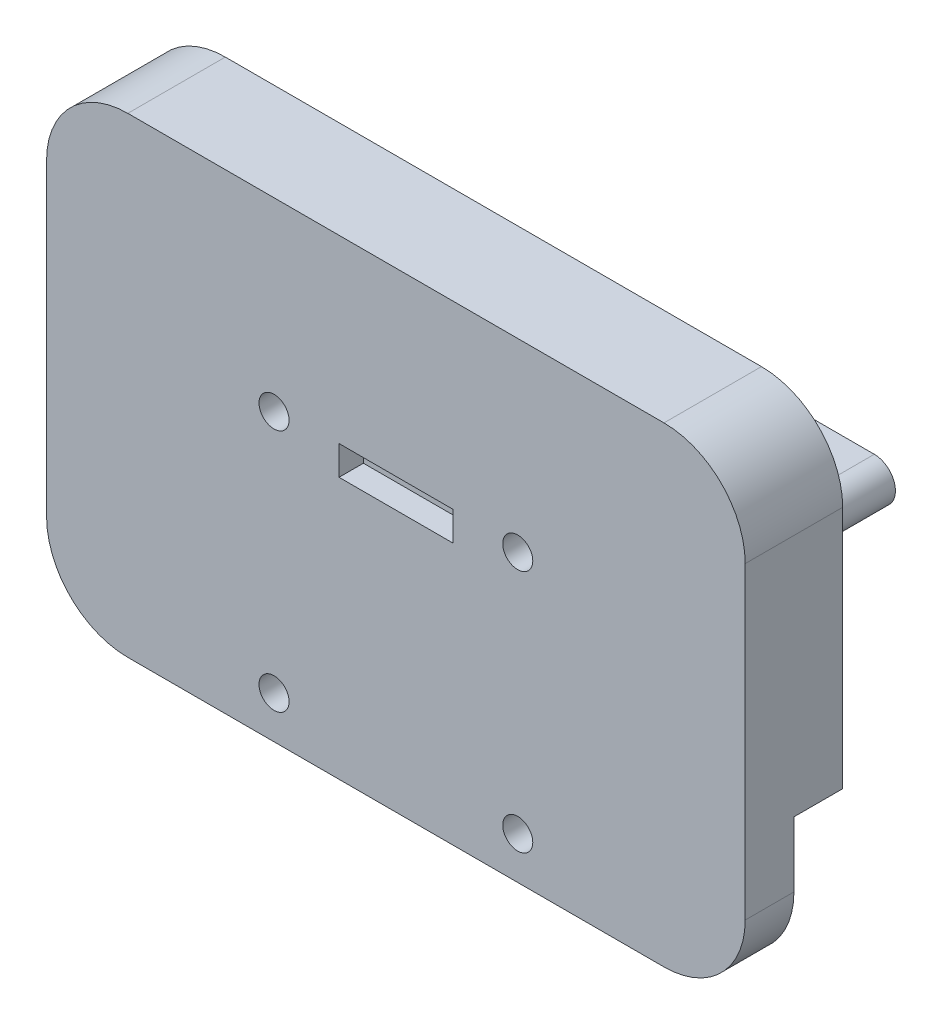
ISO-10303-21;
HEADER;
FILE_DESCRIPTION(('STEP AP214'),'2;1');
FILE_NAME('part.step','',(''),(''),'','','');
FILE_SCHEMA(('AUTOMOTIVE_DESIGN { 1 0 10303 214 1 1 1 1 }'));
ENDSEC;
DATA;
#1=APPLICATION_CONTEXT('core data for automotive mechanical design processes');
#2=APPLICATION_PROTOCOL_DEFINITION('international standard','automotive_design',2000,#1);
#3=PRODUCT_CONTEXT('',#1,'mechanical');
#4=PRODUCT('Part','Part','',(#3));
#5=PRODUCT_RELATED_PRODUCT_CATEGORY('part','',(#4));
#6=PRODUCT_DEFINITION_FORMATION('','',#4);
#7=PRODUCT_DEFINITION_CONTEXT('part definition',#1,'design');
#8=PRODUCT_DEFINITION('design','',#6,#7);
#9=PRODUCT_DEFINITION_SHAPE('','',#8);
#10=(LENGTH_UNIT() NAMED_UNIT(*) SI_UNIT(.MILLI.,.METRE.));
#11=(NAMED_UNIT(*) PLANE_ANGLE_UNIT() SI_UNIT($,.RADIAN.));
#12=(NAMED_UNIT(*) SI_UNIT($,.STERADIAN.) SOLID_ANGLE_UNIT());
#13=UNCERTAINTY_MEASURE_WITH_UNIT(LENGTH_MEASURE(1.E-05),#10,'distance_accuracy_value','');
#14=(GEOMETRIC_REPRESENTATION_CONTEXT(3) GLOBAL_UNCERTAINTY_ASSIGNED_CONTEXT((#13)) GLOBAL_UNIT_ASSIGNED_CONTEXT((#10,
#11,#12)) REPRESENTATION_CONTEXT('',''));
#15=CARTESIAN_POINT('',(0.,0.,0.));
#16=DIRECTION('',(0.,0.,1.));
#17=DIRECTION('',(1.,0.,0.));
#18=AXIS2_PLACEMENT_3D('',#15,#16,#17);
#19=CARTESIAN_POINT('',(0.,-15.,0.));
#20=DIRECTION('',(0.,-1.,0.));
#21=DIRECTION('',(0.,0.,-1.));
#22=AXIS2_PLACEMENT_3D('',#19,#20,#21);
#23=PLANE('',#22);
#24=DIRECTION('',(0.,0.,-1.));
#25=VECTOR('',#24,1.);
#26=CARTESIAN_POINT('',(-16.5,-15.,0.));
#27=LINE('',#26,#25);
#28=CARTESIAN_POINT('',(-16.5,-15.,4.));
#29=VERTEX_POINT('',#28);
#30=CARTESIAN_POINT('',(-16.5,-15.,1.));
#31=VERTEX_POINT('',#30);
#32=EDGE_CURVE('E412',#29,#31,#27,.T.);
#33=ORIENTED_EDGE('',*,*,#32,.T.);
#34=DIRECTION('',(-1.,0.,0.));
#35=VECTOR('',#34,1.);
#36=CARTESIAN_POINT('',(16.5,-15.,1.));
#37=LINE('',#36,#35);
#38=CARTESIAN_POINT('',(16.5,-15.,1.));
#39=VERTEX_POINT('',#38);
#40=EDGE_CURVE('E319',#39,#31,#37,.T.);
#41=ORIENTED_EDGE('',*,*,#40,.F.);
#42=DIRECTION('',(0.,0.,1.));
#43=VECTOR('',#42,1.);
#44=CARTESIAN_POINT('',(16.5,-15.,0.));
#45=LINE('',#44,#43);
#46=CARTESIAN_POINT('',(16.5,-15.,4.));
#47=VERTEX_POINT('',#46);
#48=EDGE_CURVE('E415',#39,#47,#45,.T.);
#49=ORIENTED_EDGE('',*,*,#48,.T.);
#50=DIRECTION('',(-1.,0.,0.));
#51=VECTOR('',#50,1.);
#52=CARTESIAN_POINT('',(21.5,-15.,4.));
#53=LINE('',#52,#51);
#54=EDGE_CURVE('E396',#47,#29,#53,.T.);
#55=ORIENTED_EDGE('',*,*,#54,.T.);
#56=EDGE_LOOP('',(#33,#41,#49,#55));
#57=FACE_BOUND('',#56,.T.);
#58=ADVANCED_FACE('F35',(#57),#23,.T.);
#59=CARTESIAN_POINT('',(7.50000000000043,-12.3999999999996,-1.));
#60=DIRECTION('',(0.,0.,1.));
#61=DIRECTION('',(1.,0.,0.));
#62=AXIS2_PLACEMENT_3D('',#59,#60,#61);
#63=CYLINDRICAL_SURFACE('',#62,0.925);
#64=CARTESIAN_POINT('',(7.50000000000043,-12.3999999999996,4.));
#65=DIRECTION('',(0.,0.,1.));
#66=DIRECTION('',(1.,0.,0.));
#67=AXIS2_PLACEMENT_3D('',#64,#65,#66);
#68=CIRCLE('',#67,0.925);
#69=CARTESIAN_POINT('',(8.42500000000043,-12.3999999999996,4.));
#70=VERTEX_POINT('',#69);
#71=EDGE_CURVE('E389',#70,#70,#68,.T.);
#72=ORIENTED_EDGE('',*,*,#71,.T.);
#73=EDGE_LOOP('',(#72));
#74=FACE_BOUND('',#73,.T.);
#75=CARTESIAN_POINT('',(7.50000000000043,-12.3999999999996,1.));
#76=DIRECTION('',(0.,0.,-1.));
#77=DIRECTION('',(-1.,0.,0.));
#78=AXIS2_PLACEMENT_3D('',#75,#76,#77);
#79=CIRCLE('',#78,0.925);
#80=CARTESIAN_POINT('',(6.57500000000043,-12.3999999999996,1.));
#81=VERTEX_POINT('',#80);
#82=EDGE_CURVE('E217',#81,#81,#79,.F.);
#83=ORIENTED_EDGE('',*,*,#82,.F.);
#84=EDGE_LOOP('',(#83));
#85=FACE_BOUND('',#84,.T.);
#86=ADVANCED_FACE('F486',(#74,#85),#63,.F.);
#87=CARTESIAN_POINT('',(-7.49999999999958,-12.4,-1.));
#88=DIRECTION('',(0.,0.,1.));
#89=DIRECTION('',(1.,0.,0.));
#90=AXIS2_PLACEMENT_3D('',#87,#88,#89);
#91=CYLINDRICAL_SURFACE('',#90,0.925);
#92=CARTESIAN_POINT('',(-7.49999999999958,-12.4,4.));
#93=DIRECTION('',(0.,0.,1.));
#94=DIRECTION('',(1.,0.,0.));
#95=AXIS2_PLACEMENT_3D('',#92,#93,#94);
#96=CIRCLE('',#95,0.925);
#97=CARTESIAN_POINT('',(-6.57499999999958,-12.4,4.));
#98=VERTEX_POINT('',#97);
#99=EDGE_CURVE('E378',#98,#98,#96,.T.);
#100=ORIENTED_EDGE('',*,*,#99,.T.);
#101=EDGE_LOOP('',(#100));
#102=FACE_BOUND('',#101,.T.);
#103=CARTESIAN_POINT('',(-7.49999999999958,-12.4,1.));
#104=DIRECTION('',(0.,0.,-1.));
#105=DIRECTION('',(-1.,0.,0.));
#106=AXIS2_PLACEMENT_3D('',#103,#104,#105);
#107=CIRCLE('',#106,0.925);
#108=CARTESIAN_POINT('',(-8.42499999999958,-12.4,1.));
#109=VERTEX_POINT('',#108);
#110=EDGE_CURVE('E326',#109,#109,#107,.F.);
#111=ORIENTED_EDGE('',*,*,#110,.F.);
#112=EDGE_LOOP('',(#111));
#113=FACE_BOUND('',#112,.T.);
#114=ADVANCED_FACE('F491',(#102,#113),#91,.F.);
#115=CARTESIAN_POINT('',(16.5,-9.99999999999999,0.));
#116=DIRECTION('',(0.,0.,1.));
#117=DIRECTION('',(1.,0.,0.));
#118=AXIS2_PLACEMENT_3D('',#115,#116,#117);
#119=CYLINDRICAL_SURFACE('',#118,5.);
#120=ORIENTED_EDGE('',*,*,#48,.F.);
#121=CARTESIAN_POINT('',(16.5,-9.99999999999999,1.));
#122=DIRECTION('',(0.,0.,-1.));
#123=DIRECTION('',(-1.,0.,0.));
#124=AXIS2_PLACEMENT_3D('',#121,#122,#123);
#125=CIRCLE('',#124,5.);
#126=CARTESIAN_POINT('',(21.5,-9.99999999999999,1.));
#127=VERTEX_POINT('',#126);
#128=EDGE_CURVE('E317',#127,#39,#125,.T.);
#129=ORIENTED_EDGE('',*,*,#128,.F.);
#130=DIRECTION('',(0.,0.,1.));
#131=VECTOR('',#130,1.);
#132=CARTESIAN_POINT('',(21.5,-9.99999999999999,0.));
#133=LINE('',#132,#131);
#134=CARTESIAN_POINT('',(21.5,-9.99999999999999,4.));
#135=VERTEX_POINT('',#134);
#136=EDGE_CURVE('E428',#135,#127,#133,.F.);
#137=ORIENTED_EDGE('',*,*,#136,.F.);
#138=CARTESIAN_POINT('',(16.5,-9.99999999999999,4.));
#139=DIRECTION('',(0.,0.,1.));
#140=DIRECTION('',(1.,0.,0.));
#141=AXIS2_PLACEMENT_3D('',#138,#139,#140);
#142=CIRCLE('',#141,5.);
#143=EDGE_CURVE('E423',#47,#135,#142,.T.);
#144=ORIENTED_EDGE('',*,*,#143,.F.);
#145=EDGE_LOOP('',(#120,#129,#137,#144));
#146=FACE_BOUND('',#145,.T.);
#147=ADVANCED_FACE('F469',(#146),#119,.T.);
#148=CARTESIAN_POINT('',(-16.5,-9.99999999999999,0.));
#149=DIRECTION('',(0.,0.,-1.));
#150=DIRECTION('',(-1.,0.,0.));
#151=AXIS2_PLACEMENT_3D('',#148,#149,#150);
#152=CYLINDRICAL_SURFACE('',#151,5.);
#153=DIRECTION('',(0.,0.,-1.));
#154=VECTOR('',#153,1.);
#155=CARTESIAN_POINT('',(-21.5,-9.99999999999999,0.));
#156=LINE('',#155,#154);
#157=CARTESIAN_POINT('',(-21.5,-9.99999999999999,1.));
#158=VERTEX_POINT('',#157);
#159=CARTESIAN_POINT('',(-21.5,-9.99999999999999,4.));
#160=VERTEX_POINT('',#159);
#161=EDGE_CURVE('E435',#158,#160,#156,.F.);
#162=ORIENTED_EDGE('',*,*,#161,.F.);
#163=CARTESIAN_POINT('',(-16.5,-9.99999999999999,1.));
#164=DIRECTION('',(0.,0.,-1.));
#165=DIRECTION('',(-1.,0.,0.));
#166=AXIS2_PLACEMENT_3D('',#163,#164,#165);
#167=CIRCLE('',#166,5.);
#168=EDGE_CURVE('E321',#31,#158,#167,.T.);
#169=ORIENTED_EDGE('',*,*,#168,.F.);
#170=ORIENTED_EDGE('',*,*,#32,.F.);
#171=CARTESIAN_POINT('',(-16.5,-9.99999999999999,4.));
#172=DIRECTION('',(0.,0.,1.));
#173=DIRECTION('',(1.,0.,0.));
#174=AXIS2_PLACEMENT_3D('',#171,#172,#173);
#175=CIRCLE('',#174,5.);
#176=EDGE_CURVE('E417',#160,#29,#175,.T.);
#177=ORIENTED_EDGE('',*,*,#176,.F.);
#178=EDGE_LOOP('',(#162,#169,#170,#177));
#179=FACE_BOUND('',#178,.T.);
#180=ADVANCED_FACE('F37',(#179),#152,.T.);
#181=CARTESIAN_POINT('',(13.5,14.,-3.));
#182=DIRECTION('',(0.,-1.,0.));
#183=DIRECTION('',(0.,0.,-1.));
#184=AXIS2_PLACEMENT_3D('',#181,#182,#183);
#185=PLANE('',#184);
#186=DIRECTION('',(-1.,0.,0.));
#187=VECTOR('',#186,1.);
#188=CARTESIAN_POINT('',(-13.5,14.,4.));
#189=LINE('',#188,#187);
#190=CARTESIAN_POINT('',(16.5,14.,4.));
#191=VERTEX_POINT('',#190);
#192=CARTESIAN_POINT('',(-16.5,14.,4.));
#193=VERTEX_POINT('',#192);
#194=EDGE_CURVE('E409',#191,#193,#189,.T.);
#195=ORIENTED_EDGE('',*,*,#194,.F.);
#196=DIRECTION('',(0.,0.,1.));
#197=VECTOR('',#196,1.);
#198=CARTESIAN_POINT('',(16.5,14.,-1.));
#199=LINE('',#198,#197);
#200=CARTESIAN_POINT('',(16.5,14.,-2.));
#201=VERTEX_POINT('',#200);
#202=EDGE_CURVE('E433',#191,#201,#199,.F.);
#203=ORIENTED_EDGE('',*,*,#202,.T.);
#204=DIRECTION('',(1.,0.,0.));
#205=VECTOR('',#204,1.);
#206=CARTESIAN_POINT('',(-16.5,14.,-2.));
#207=LINE('',#206,#205);
#208=CARTESIAN_POINT('',(-16.5,14.,-2.));
#209=VERTEX_POINT('',#208);
#210=EDGE_CURVE('E269',#209,#201,#207,.T.);
#211=ORIENTED_EDGE('',*,*,#210,.F.);
#212=DIRECTION('',(0.,0.,-1.));
#213=VECTOR('',#212,1.);
#214=CARTESIAN_POINT('',(-16.5,14.,4.));
#215=LINE('',#214,#213);
#216=EDGE_CURVE('E431',#209,#193,#215,.F.);
#217=ORIENTED_EDGE('',*,*,#216,.T.);
#218=EDGE_LOOP('',(#195,#203,#211,#217));
#219=FACE_BOUND('',#218,.T.);
#220=ADVANCED_FACE('F452',(#219),#185,.F.);
#221=CARTESIAN_POINT('',(-21.5,0.,0.));
#222=DIRECTION('',(-1.,0.,0.));
#223=DIRECTION('',(0.,-1.,0.));
#224=AXIS2_PLACEMENT_3D('',#221,#222,#223);
#225=PLANE('',#224);
#226=DIRECTION('',(0.,0.,1.));
#227=VECTOR('',#226,1.);
#228=CARTESIAN_POINT('',(-21.5,-6.,-1.));
#229=LINE('',#228,#227);
#230=CARTESIAN_POINT('',(-21.5,-6.,-2.));
#231=VERTEX_POINT('',#230);
#232=CARTESIAN_POINT('',(-21.5,-6.,1.));
#233=VERTEX_POINT('',#232);
#234=EDGE_CURVE('E404',#231,#233,#229,.T.);
#235=ORIENTED_EDGE('',*,*,#234,.T.);
#236=DIRECTION('',(0.,1.,0.));
#237=VECTOR('',#236,1.);
#238=CARTESIAN_POINT('',(-21.5,-9.99999999999999,1.));
#239=LINE('',#238,#237);
#240=EDGE_CURVE('E323',#158,#233,#239,.T.);
#241=ORIENTED_EDGE('',*,*,#240,.F.);
#242=ORIENTED_EDGE('',*,*,#161,.T.);
#243=DIRECTION('',(0.,1.,0.));
#244=VECTOR('',#243,1.);
#245=CARTESIAN_POINT('',(-21.5,-9.99999999999999,4.));
#246=LINE('',#245,#244);
#247=CARTESIAN_POINT('',(-21.5,9.00000000000001,4.));
#248=VERTEX_POINT('',#247);
#249=EDGE_CURVE('E406',#160,#248,#246,.T.);
#250=ORIENTED_EDGE('',*,*,#249,.T.);
#251=DIRECTION('',(0.,0.,-1.));
#252=VECTOR('',#251,1.);
#253=CARTESIAN_POINT('',(-21.5,9.00000000000001,-1.));
#254=LINE('',#253,#252);
#255=CARTESIAN_POINT('',(-21.5,9.00000000000001,-2.));
#256=VERTEX_POINT('',#255);
#257=EDGE_CURVE('E43',#248,#256,#254,.T.);
#258=ORIENTED_EDGE('',*,*,#257,.T.);
#259=DIRECTION('',(0.,1.,0.));
#260=VECTOR('',#259,1.);
#261=CARTESIAN_POINT('',(-21.5,-6.,-2.));
#262=LINE('',#261,#260);
#263=EDGE_CURVE('E281',#231,#256,#262,.T.);
#264=ORIENTED_EDGE('',*,*,#263,.F.);
#265=EDGE_LOOP('',(#235,#241,#242,#250,#258,#264));
#266=FACE_BOUND('',#265,.T.);
#267=ADVANCED_FACE('F439',(#266),#225,.T.);
#268=CARTESIAN_POINT('',(21.5,0.,0.));
#269=DIRECTION('',(1.,0.,0.));
#270=DIRECTION('',(0.,1.,0.));
#271=AXIS2_PLACEMENT_3D('',#268,#269,#270);
#272=PLANE('',#271);
#273=DIRECTION('',(0.,-1.,0.));
#274=VECTOR('',#273,1.);
#275=CARTESIAN_POINT('',(21.5,-5.99999999999999,1.));
#276=LINE('',#275,#274);
#277=CARTESIAN_POINT('',(21.5,-5.99999999999999,1.));
#278=VERTEX_POINT('',#277);
#279=EDGE_CURVE('E315',#278,#127,#276,.T.);
#280=ORIENTED_EDGE('',*,*,#279,.F.);
#281=DIRECTION('',(0.,0.,-1.));
#282=VECTOR('',#281,1.);
#283=CARTESIAN_POINT('',(21.5,-5.99999999999999,0.));
#284=LINE('',#283,#282);
#285=CARTESIAN_POINT('',(21.5,-5.99999999999999,-2.));
#286=VERTEX_POINT('',#285);
#287=EDGE_CURVE('E399',#278,#286,#284,.T.);
#288=ORIENTED_EDGE('',*,*,#287,.T.);
#289=DIRECTION('',(0.,-1.,0.));
#290=VECTOR('',#289,1.);
#291=CARTESIAN_POINT('',(21.5,9.00000000000001,-2.));
#292=LINE('',#291,#290);
#293=CARTESIAN_POINT('',(21.5,9.00000000000001,-2.));
#294=VERTEX_POINT('',#293);
#295=EDGE_CURVE('E275',#294,#286,#292,.T.);
#296=ORIENTED_EDGE('',*,*,#295,.F.);
#297=DIRECTION('',(0.,0.,1.));
#298=VECTOR('',#297,1.);
#299=CARTESIAN_POINT('',(21.5,9.00000000000001,4.));
#300=LINE('',#299,#298);
#301=CARTESIAN_POINT('',(21.5,9.00000000000001,4.));
#302=VERTEX_POINT('',#301);
#303=EDGE_CURVE('E425',#294,#302,#300,.T.);
#304=ORIENTED_EDGE('',*,*,#303,.T.);
#305=DIRECTION('',(0.,-1.,0.));
#306=VECTOR('',#305,1.);
#307=CARTESIAN_POINT('',(21.5,14.,4.));
#308=LINE('',#307,#306);
#309=EDGE_CURVE('E401',#302,#135,#308,.T.);
#310=ORIENTED_EDGE('',*,*,#309,.T.);
#311=ORIENTED_EDGE('',*,*,#136,.T.);
#312=EDGE_LOOP('',(#280,#288,#296,#304,#310,#311));
#313=FACE_BOUND('',#312,.T.);
#314=ADVANCED_FACE('F461',(#313),#272,.T.);
#315=CARTESIAN_POINT('',(13.5,-5.99999999999999,-3.));
#316=DIRECTION('',(0.,1.,0.));
#317=DIRECTION('',(0.,0.,1.));
#318=AXIS2_PLACEMENT_3D('',#315,#316,#317);
#319=PLANE('',#318);
#320=ORIENTED_EDGE('',*,*,#234,.F.);
#321=DIRECTION('',(-1.,0.,0.));
#322=VECTOR('',#321,1.);
#323=CARTESIAN_POINT('',(21.5,-5.99999999999999,-2.));
#324=LINE('',#323,#322);
#325=EDGE_CURVE('E278',#286,#231,#324,.T.);
#326=ORIENTED_EDGE('',*,*,#325,.F.);
#327=ORIENTED_EDGE('',*,*,#287,.F.);
#328=DIRECTION('',(1.,0.,0.));
#329=VECTOR('',#328,1.);
#330=CARTESIAN_POINT('',(-21.5,-6.,1.));
#331=LINE('',#330,#329);
#332=EDGE_CURVE('E312',#233,#278,#331,.T.);
#333=ORIENTED_EDGE('',*,*,#332,.F.);
#334=EDGE_LOOP('',(#320,#326,#327,#333));
#335=FACE_BOUND('',#334,.T.);
#336=ADVANCED_FACE('F478',(#335),#319,.F.);
#337=CARTESIAN_POINT('',(0.,0.,4.));
#338=DIRECTION('',(0.,0.,1.));
#339=DIRECTION('',(1.,0.,0.));
#340=AXIS2_PLACEMENT_3D('',#337,#338,#339);
#341=PLANE('',#340);
#342=DIRECTION('',(-1.,0.,0.));
#343=VECTOR('',#342,1.);
#344=CARTESIAN_POINT('',(-3.5,2.90000000000001,4.));
#345=LINE('',#344,#343);
#346=CARTESIAN_POINT('',(3.5,2.90000000000001,4.));
#347=VERTEX_POINT('',#346);
#348=CARTESIAN_POINT('',(-3.5,2.90000000000001,4.));
#349=VERTEX_POINT('',#348);
#350=EDGE_CURVE('E343',#347,#349,#345,.T.);
#351=ORIENTED_EDGE('',*,*,#350,.F.);
#352=DIRECTION('',(0.,1.,0.));
#353=VECTOR('',#352,1.);
#354=CARTESIAN_POINT('',(3.5,2.90000000000001,4.));
#355=LINE('',#354,#353);
#356=CARTESIAN_POINT('',(3.5,1.10000000000001,4.));
#357=VERTEX_POINT('',#356);
#358=EDGE_CURVE('E357',#357,#347,#355,.T.);
#359=ORIENTED_EDGE('',*,*,#358,.F.);
#360=DIRECTION('',(1.,0.,0.));
#361=VECTOR('',#360,1.);
#362=CARTESIAN_POINT('',(3.5,1.10000000000001,4.));
#363=LINE('',#362,#361);
#364=CARTESIAN_POINT('',(-3.5,1.10000000000001,4.));
#365=VERTEX_POINT('',#364);
#366=EDGE_CURVE('E371',#365,#357,#363,.T.);
#367=ORIENTED_EDGE('',*,*,#366,.F.);
#368=DIRECTION('',(0.,-1.,0.));
#369=VECTOR('',#368,1.);
#370=CARTESIAN_POINT('',(-3.5,2.90000000000001,4.));
#371=LINE('',#370,#369);
#372=EDGE_CURVE('E368',#349,#365,#371,.T.);
#373=ORIENTED_EDGE('',*,*,#372,.F.);
#374=EDGE_LOOP('',(#351,#359,#367,#373));
#375=FACE_BOUND('',#374,.T.);
#376=ORIENTED_EDGE('',*,*,#99,.F.);
#377=EDGE_LOOP('',(#376));
#378=FACE_BOUND('',#377,.T.);
#379=ORIENTED_EDGE('',*,*,#71,.F.);
#380=EDGE_LOOP('',(#379));
#381=FACE_BOUND('',#380,.T.);
#382=CARTESIAN_POINT('',(7.5,2.60000000000043,4.));
#383=DIRECTION('',(0.,0.,1.));
#384=DIRECTION('',(1.,0.,0.));
#385=AXIS2_PLACEMENT_3D('',#382,#383,#384);
#386=CIRCLE('',#385,0.925);
#387=CARTESIAN_POINT('',(8.425,2.60000000000043,4.));
#388=VERTEX_POINT('',#387);
#389=EDGE_CURVE('E385',#388,#388,#386,.T.);
#390=ORIENTED_EDGE('',*,*,#389,.F.);
#391=EDGE_LOOP('',(#390));
#392=FACE_BOUND('',#391,.T.);
#393=CARTESIAN_POINT('',(-7.5,2.60000000000001,4.));
#394=DIRECTION('',(0.,0.,1.));
#395=DIRECTION('',(1.,0.,0.));
#396=AXIS2_PLACEMENT_3D('',#393,#394,#395);
#397=CIRCLE('',#396,0.925000000000001);
#398=CARTESIAN_POINT('',(-6.575,2.60000000000001,4.));
#399=VERTEX_POINT('',#398);
#400=EDGE_CURVE('E388',#399,#399,#397,.T.);
#401=ORIENTED_EDGE('',*,*,#400,.F.);
#402=EDGE_LOOP('',(#401));
#403=FACE_BOUND('',#402,.T.);
#404=ORIENTED_EDGE('',*,*,#54,.F.);
#405=ORIENTED_EDGE('',*,*,#143,.T.);
#406=ORIENTED_EDGE('',*,*,#309,.F.);
#407=CARTESIAN_POINT('',(16.5,9.00000000000001,4.));
#408=DIRECTION('',(0.,0.,1.));
#409=DIRECTION('',(1.,0.,0.));
#410=AXIS2_PLACEMENT_3D('',#407,#408,#409);
#411=CIRCLE('',#410,5.);
#412=EDGE_CURVE('E421',#302,#191,#411,.T.);
#413=ORIENTED_EDGE('',*,*,#412,.T.);
#414=ORIENTED_EDGE('',*,*,#194,.T.);
#415=CARTESIAN_POINT('',(-16.5,9.00000000000001,4.));
#416=DIRECTION('',(0.,0.,1.));
#417=DIRECTION('',(1.,0.,0.));
#418=AXIS2_PLACEMENT_3D('',#415,#416,#417);
#419=CIRCLE('',#418,5.);
#420=EDGE_CURVE('E419',#193,#248,#419,.T.);
#421=ORIENTED_EDGE('',*,*,#420,.T.);
#422=ORIENTED_EDGE('',*,*,#249,.F.);
#423=ORIENTED_EDGE('',*,*,#176,.T.);
#424=EDGE_LOOP('',(#404,#405,#406,#413,#414,#421,#422,#423));
#425=FACE_BOUND('',#424,.T.);
#426=ADVANCED_FACE('F465',(#375,#378,#381,#392,#403,#425),#341,.T.);
#427=CARTESIAN_POINT('',(-7.5,2.60000000000001,-1.));
#428=DIRECTION('',(0.,0.,1.));
#429=DIRECTION('',(1.,0.,0.));
#430=AXIS2_PLACEMENT_3D('',#427,#428,#429);
#431=CYLINDRICAL_SURFACE('',#430,0.925000000000001);
#432=ORIENTED_EDGE('',*,*,#400,.T.);
#433=EDGE_LOOP('',(#432));
#434=FACE_BOUND('',#433,.T.);
#435=CARTESIAN_POINT('',(-7.5,2.60000000000001,-2.));
#436=DIRECTION('',(0.,0.,-1.));
#437=DIRECTION('',(-1.,0.,0.));
#438=AXIS2_PLACEMENT_3D('',#435,#436,#437);
#439=CIRCLE('',#438,0.925000000000001);
#440=CARTESIAN_POINT('',(-8.425,2.60000000000001,-2.));
#441=VERTEX_POINT('',#440);
#442=EDGE_CURVE('E260',#441,#441,#439,.T.);
#443=ORIENTED_EDGE('',*,*,#442,.T.);
#444=EDGE_LOOP('',(#443));
#445=FACE_BOUND('',#444,.T.);
#446=ADVANCED_FACE('F496',(#434,#445),#431,.F.);
#447=CARTESIAN_POINT('',(7.5,2.60000000000043,-1.));
#448=DIRECTION('',(0.,0.,1.));
#449=DIRECTION('',(1.,0.,0.));
#450=AXIS2_PLACEMENT_3D('',#447,#448,#449);
#451=CYLINDRICAL_SURFACE('',#450,0.925);
#452=ORIENTED_EDGE('',*,*,#389,.T.);
#453=EDGE_LOOP('',(#452));
#454=FACE_BOUND('',#453,.T.);
#455=CARTESIAN_POINT('',(7.5,2.60000000000043,-2.));
#456=DIRECTION('',(0.,0.,-1.));
#457=DIRECTION('',(-1.,0.,0.));
#458=AXIS2_PLACEMENT_3D('',#455,#456,#457);
#459=CIRCLE('',#458,0.925);
#460=CARTESIAN_POINT('',(6.575,2.60000000000043,-2.));
#461=VERTEX_POINT('',#460);
#462=EDGE_CURVE('E263',#461,#461,#459,.T.);
#463=ORIENTED_EDGE('',*,*,#462,.T.);
#464=EDGE_LOOP('',(#463));
#465=FACE_BOUND('',#464,.T.);
#466=ADVANCED_FACE('F586',(#454,#465),#451,.F.);
#467=CARTESIAN_POINT('',(-3.5,2.90000000000001,2.5));
#468=DIRECTION('',(0.,1.,0.));
#469=DIRECTION('',(0.,0.,1.));
#470=AXIS2_PLACEMENT_3D('',#467,#468,#469);
#471=PLANE('',#470);
#472=ORIENTED_EDGE('',*,*,#350,.T.);
#473=DIRECTION('',(0.,0.,1.));
#474=VECTOR('',#473,1.);
#475=CARTESIAN_POINT('',(-3.5,2.90000000000001,2.5));
#476=LINE('',#475,#474);
#477=CARTESIAN_POINT('',(-3.5,2.90000000000001,2.5));
#478=VERTEX_POINT('',#477);
#479=EDGE_CURVE('E366',#478,#349,#476,.T.);
#480=ORIENTED_EDGE('',*,*,#479,.F.);
#481=DIRECTION('',(-1.,0.,0.));
#482=VECTOR('',#481,1.);
#483=CARTESIAN_POINT('',(-3.5,2.90000000000001,2.5));
#484=LINE('',#483,#482);
#485=CARTESIAN_POINT('',(3.5,2.90000000000001,2.5));
#486=VERTEX_POINT('',#485);
#487=EDGE_CURVE('E353',#486,#478,#484,.T.);
#488=ORIENTED_EDGE('',*,*,#487,.F.);
#489=DIRECTION('',(0.,0.,1.));
#490=VECTOR('',#489,1.);
#491=CARTESIAN_POINT('',(3.5,2.90000000000001,2.5));
#492=LINE('',#491,#490);
#493=EDGE_CURVE('E376',#486,#347,#492,.T.);
#494=ORIENTED_EDGE('',*,*,#493,.T.);
#495=EDGE_LOOP('',(#472,#480,#488,#494));
#496=FACE_BOUND('',#495,.T.);
#497=ADVANCED_FACE('F576',(#496),#471,.F.);
#498=CARTESIAN_POINT('',(3.5,2.90000000000001,2.5));
#499=DIRECTION('',(1.,0.,0.));
#500=DIRECTION('',(0.,0.,-1.));
#501=AXIS2_PLACEMENT_3D('',#498,#499,#500);
#502=PLANE('',#501);
#503=ORIENTED_EDGE('',*,*,#358,.T.);
#504=ORIENTED_EDGE('',*,*,#493,.F.);
#505=DIRECTION('',(0.,1.,0.));
#506=VECTOR('',#505,1.);
#507=CARTESIAN_POINT('',(3.5,2.90000000000001,2.5));
#508=LINE('',#507,#506);
#509=CARTESIAN_POINT('',(3.5,1.10000000000001,2.5));
#510=VERTEX_POINT('',#509);
#511=EDGE_CURVE('E363',#510,#486,#508,.T.);
#512=ORIENTED_EDGE('',*,*,#511,.F.);
#513=DIRECTION('',(0.,0.,1.));
#514=VECTOR('',#513,1.);
#515=CARTESIAN_POINT('',(3.5,1.10000000000001,2.5));
#516=LINE('',#515,#514);
#517=EDGE_CURVE('E379',#510,#357,#516,.T.);
#518=ORIENTED_EDGE('',*,*,#517,.T.);
#519=EDGE_LOOP('',(#503,#504,#512,#518));
#520=FACE_BOUND('',#519,.T.);
#521=ADVANCED_FACE('F572',(#520),#502,.F.);
#522=CARTESIAN_POINT('',(3.5,1.10000000000001,2.5));
#523=DIRECTION('',(0.,-1.,0.));
#524=DIRECTION('',(0.,0.,-1.));
#525=AXIS2_PLACEMENT_3D('',#522,#523,#524);
#526=PLANE('',#525);
#527=ORIENTED_EDGE('',*,*,#366,.T.);
#528=ORIENTED_EDGE('',*,*,#517,.F.);
#529=DIRECTION('',(1.,0.,0.));
#530=VECTOR('',#529,1.);
#531=CARTESIAN_POINT('',(3.5,1.10000000000001,2.5));
#532=LINE('',#531,#530);
#533=CARTESIAN_POINT('',(-3.5,1.10000000000001,2.5));
#534=VERTEX_POINT('',#533);
#535=EDGE_CURVE('E360',#534,#510,#532,.T.);
#536=ORIENTED_EDGE('',*,*,#535,.F.);
#537=DIRECTION('',(0.,0.,1.));
#538=VECTOR('',#537,1.);
#539=CARTESIAN_POINT('',(-3.5,1.10000000000001,2.5));
#540=LINE('',#539,#538);
#541=EDGE_CURVE('E381',#534,#365,#540,.T.);
#542=ORIENTED_EDGE('',*,*,#541,.T.);
#543=EDGE_LOOP('',(#527,#528,#536,#542));
#544=FACE_BOUND('',#543,.T.);
#545=ADVANCED_FACE('F575',(#544),#526,.F.);
#546=CARTESIAN_POINT('',(-3.5,2.90000000000001,2.5));
#547=DIRECTION('',(-1.,0.,0.));
#548=DIRECTION('',(0.,0.,1.));
#549=AXIS2_PLACEMENT_3D('',#546,#547,#548);
#550=PLANE('',#549);
#551=ORIENTED_EDGE('',*,*,#372,.T.);
#552=ORIENTED_EDGE('',*,*,#541,.F.);
#553=DIRECTION('',(0.,-1.,0.));
#554=VECTOR('',#553,1.);
#555=CARTESIAN_POINT('',(-3.5,2.90000000000001,2.5));
#556=LINE('',#555,#554);
#557=EDGE_CURVE('E356',#478,#534,#556,.T.);
#558=ORIENTED_EDGE('',*,*,#557,.F.);
#559=ORIENTED_EDGE('',*,*,#479,.T.);
#560=EDGE_LOOP('',(#551,#552,#558,#559));
#561=FACE_BOUND('',#560,.T.);
#562=ADVANCED_FACE('F570',(#561),#550,.F.);
#563=CARTESIAN_POINT('',(0.,0.,2.5));
#564=DIRECTION('',(0.,0.,-1.));
#565=DIRECTION('',(-1.,0.,0.));
#566=AXIS2_PLACEMENT_3D('',#563,#564,#565);
#567=PLANE('',#566);
#568=ORIENTED_EDGE('',*,*,#487,.T.);
#569=ORIENTED_EDGE('',*,*,#557,.T.);
#570=ORIENTED_EDGE('',*,*,#535,.T.);
#571=ORIENTED_EDGE('',*,*,#511,.T.);
#572=EDGE_LOOP('',(#568,#569,#570,#571));
#573=FACE_BOUND('',#572,.T.);
#574=ADVANCED_FACE('F512',(#573),#567,.F.);
#575=CARTESIAN_POINT('',(16.5,9.00000000000001,0.));
#576=DIRECTION('',(0.,0.,-1.));
#577=DIRECTION('',(-1.,0.,0.));
#578=AXIS2_PLACEMENT_3D('',#575,#576,#577);
#579=CYLINDRICAL_SURFACE('',#578,5.);
#580=ORIENTED_EDGE('',*,*,#303,.F.);
#581=CARTESIAN_POINT('',(16.5,9.00000000000001,-2.));
#582=DIRECTION('',(0.,0.,-1.));
#583=DIRECTION('',(-1.,0.,0.));
#584=AXIS2_PLACEMENT_3D('',#581,#582,#583);
#585=CIRCLE('',#584,5.);
#586=EDGE_CURVE('E272',#201,#294,#585,.T.);
#587=ORIENTED_EDGE('',*,*,#586,.F.);
#588=ORIENTED_EDGE('',*,*,#202,.F.);
#589=ORIENTED_EDGE('',*,*,#412,.F.);
#590=EDGE_LOOP('',(#580,#587,#588,#589));
#591=FACE_BOUND('',#590,.T.);
#592=ADVANCED_FACE('F457',(#591),#579,.T.);
#593=CARTESIAN_POINT('',(-16.5,9.00000000000001,0.));
#594=DIRECTION('',(0.,0.,1.));
#595=DIRECTION('',(1.,0.,0.));
#596=AXIS2_PLACEMENT_3D('',#593,#594,#595);
#597=CYLINDRICAL_SURFACE('',#596,5.);
#598=ORIENTED_EDGE('',*,*,#420,.F.);
#599=ORIENTED_EDGE('',*,*,#216,.F.);
#600=CARTESIAN_POINT('',(-16.5,9.00000000000001,-2.));
#601=DIRECTION('',(0.,0.,-1.));
#602=DIRECTION('',(-1.,0.,0.));
#603=AXIS2_PLACEMENT_3D('',#600,#601,#602);
#604=CIRCLE('',#603,5.);
#605=EDGE_CURVE('E266',#256,#209,#604,.T.);
#606=ORIENTED_EDGE('',*,*,#605,.F.);
#607=ORIENTED_EDGE('',*,*,#257,.F.);
#608=EDGE_LOOP('',(#598,#599,#606,#607));
#609=FACE_BOUND('',#608,.T.);
#610=ADVANCED_FACE('F448',(#609),#597,.T.);
#611=CARTESIAN_POINT('',(16.5,-9.99999999999999,1.));
#612=DIRECTION('',(0.,0.,-1.));
#613=DIRECTION('',(-1.,0.,0.));
#614=AXIS2_PLACEMENT_3D('',#611,#612,#613);
#615=PLANE('',#614);
#616=ORIENTED_EDGE('',*,*,#332,.T.);
#617=ORIENTED_EDGE('',*,*,#279,.T.);
#618=ORIENTED_EDGE('',*,*,#128,.T.);
#619=ORIENTED_EDGE('',*,*,#40,.T.);
#620=ORIENTED_EDGE('',*,*,#168,.T.);
#621=ORIENTED_EDGE('',*,*,#240,.T.);
#622=EDGE_LOOP('',(#616,#617,#618,#619,#620,#621));
#623=FACE_BOUND('',#622,.T.);
#624=ORIENTED_EDGE('',*,*,#110,.T.);
#625=EDGE_LOOP('',(#624));
#626=FACE_BOUND('',#625,.T.);
#627=ORIENTED_EDGE('',*,*,#82,.T.);
#628=EDGE_LOOP('',(#627));
#629=FACE_BOUND('',#628,.T.);
#630=ADVANCED_FACE('F472',(#623,#626,#629),#615,.T.);
#631=CARTESIAN_POINT('',(-16.5,9.00000000000001,-2.));
#632=DIRECTION('',(0.,0.,-1.));
#633=DIRECTION('',(-1.,0.,0.));
#634=AXIS2_PLACEMENT_3D('',#631,#632,#633);
#635=PLANE('',#634);
#636=CARTESIAN_POINT('',(19.4453766581255,7.49999999999997,-2.));
#637=DIRECTION('',(0.,0.,-1.));
#638=DIRECTION('',(-1.,0.,0.));
#639=AXIS2_PLACEMENT_3D('',#636,#637,#638);
#640=CIRCLE('',#639,1.29999999999997);
#641=CARTESIAN_POINT('',(19.995127763056,6.32196191800617,-2.));
#642=VERTEX_POINT('',#641);
#643=CARTESIAN_POINT('',(19.4453766581255,8.79999999999994,-2.));
#644=VERTEX_POINT('',#643);
#645=EDGE_CURVE('E57',#642,#644,#640,.F.);
#646=ORIENTED_EDGE('',*,*,#645,.T.);
#647=DIRECTION('',(-1.,0.,0.));
#648=VECTOR('',#647,1.);
#649=CARTESIAN_POINT('',(13.4999999999994,8.79999999999998,-2.));
#650=LINE('',#649,#648);
#651=CARTESIAN_POINT('',(13.4999999999994,8.79999999999998,-2.));
#652=VERTEX_POINT('',#651);
#653=EDGE_CURVE('E50',#644,#652,#650,.T.);
#654=ORIENTED_EDGE('',*,*,#653,.T.);
#655=CARTESIAN_POINT('',(13.4999999999994,7.49999999999998,-2.));
#656=DIRECTION('',(0.,0.,-1.));
#657=DIRECTION('',(-1.,0.,0.));
#658=AXIS2_PLACEMENT_3D('',#655,#656,#657);
#659=CIRCLE('',#658,1.3);
#660=CARTESIAN_POINT('',(12.1999999999994,7.49999999999998,-2.));
#661=VERTEX_POINT('',#660);
#662=EDGE_CURVE('E298',#652,#661,#659,.F.);
#663=ORIENTED_EDGE('',*,*,#662,.T.);
#664=DIRECTION('',(0.,-1.,0.));
#665=VECTOR('',#664,1.);
#666=CARTESIAN_POINT('',(12.1999999999994,5.51058907144937,-2.));
#667=LINE('',#666,#665);
#668=CARTESIAN_POINT('',(12.1999999999994,5.51058907144937,-2.));
#669=VERTEX_POINT('',#668);
#670=EDGE_CURVE('E301',#661,#669,#667,.T.);
#671=ORIENTED_EDGE('',*,*,#670,.T.);
#672=CARTESIAN_POINT('',(13.9999999999994,5.51058907144937,-2.));
#673=DIRECTION('',(0.,0.,-1.));
#674=DIRECTION('',(-1.,0.,0.));
#675=AXIS2_PLACEMENT_3D('',#672,#673,#674);
#676=CIRCLE('',#675,1.8);
#677=CARTESIAN_POINT('',(14.7611938375955,3.8794594194579,-2.));
#678=VERTEX_POINT('',#677);
#679=EDGE_CURVE('E304',#669,#678,#676,.F.);
#680=ORIENTED_EDGE('',*,*,#679,.T.);
#681=DIRECTION('',(0.906183139995264,0.422885465331127,0.));
#682=VECTOR('',#681,1.);
#683=CARTESIAN_POINT('',(19.995127763056,6.32196191800617,-2.));
#684=LINE('',#683,#682);
#685=EDGE_CURVE('E307',#678,#642,#684,.T.);
#686=ORIENTED_EDGE('',*,*,#685,.T.);
#687=EDGE_LOOP('',(#646,#654,#663,#671,#680,#686));
#688=FACE_BOUND('',#687,.T.);
#689=CARTESIAN_POINT('',(-13.5,7.5,-2.));
#690=DIRECTION('',(0.,0.,-1.));
#691=DIRECTION('',(-1.,0.,0.));
#692=AXIS2_PLACEMENT_3D('',#689,#690,#691);
#693=CIRCLE('',#692,1.3);
#694=CARTESIAN_POINT('',(-12.2,7.5,-2.));
#695=VERTEX_POINT('',#694);
#696=CARTESIAN_POINT('',(-13.5,8.8,-2.));
#697=VERTEX_POINT('',#696);
#698=EDGE_CURVE('E293',#695,#697,#693,.F.);
#699=ORIENTED_EDGE('',*,*,#698,.T.);
#700=DIRECTION('',(-1.,0.,0.));
#701=VECTOR('',#700,1.);
#702=CARTESIAN_POINT('',(-19.4453766581261,8.79999999999998,-2.));
#703=LINE('',#702,#701);
#704=CARTESIAN_POINT('',(-19.4453766581261,8.79999999999998,-2.));
#705=VERTEX_POINT('',#704);
#706=EDGE_CURVE('E296',#697,#705,#703,.T.);
#707=ORIENTED_EDGE('',*,*,#706,.T.);
#708=CARTESIAN_POINT('',(-19.4453766581261,7.50000000000001,-2.));
#709=DIRECTION('',(0.,0.,-1.));
#710=DIRECTION('',(-1.,0.,0.));
#711=AXIS2_PLACEMENT_3D('',#708,#709,#710);
#712=CIRCLE('',#711,1.29999999999996);
#713=CARTESIAN_POINT('',(-19.9951277630566,6.32196191800622,-2.));
#714=VERTEX_POINT('',#713);
#715=EDGE_CURVE('E11',#705,#714,#712,.F.);
#716=ORIENTED_EDGE('',*,*,#715,.T.);
#717=DIRECTION('',(0.906183139995262,-0.422885465331131,0.));
#718=VECTOR('',#717,1.);
#719=CARTESIAN_POINT('',(-14.761193837596,3.87945941945793,-2.));
#720=LINE('',#719,#718);
#721=CARTESIAN_POINT('',(-14.761193837596,3.87945941945793,-2.));
#722=VERTEX_POINT('',#721);
#723=EDGE_CURVE('E284',#714,#722,#720,.T.);
#724=ORIENTED_EDGE('',*,*,#723,.T.);
#725=CARTESIAN_POINT('',(-14.,5.5105890714494,-2.));
#726=DIRECTION('',(0.,0.,-1.));
#727=DIRECTION('',(-1.,0.,0.));
#728=AXIS2_PLACEMENT_3D('',#725,#726,#727);
#729=CIRCLE('',#728,1.8);
#730=CARTESIAN_POINT('',(-12.2,5.5105890714494,-2.));
#731=VERTEX_POINT('',#730);
#732=EDGE_CURVE('E287',#722,#731,#729,.F.);
#733=ORIENTED_EDGE('',*,*,#732,.T.);
#734=DIRECTION('',(0.,1.,0.));
#735=VECTOR('',#734,1.);
#736=CARTESIAN_POINT('',(-12.2,7.5,-2.));
#737=LINE('',#736,#735);
#738=EDGE_CURVE('E290',#731,#695,#737,.T.);
#739=ORIENTED_EDGE('',*,*,#738,.T.);
#740=EDGE_LOOP('',(#699,#707,#716,#724,#733,#739));
#741=FACE_BOUND('',#740,.T.);
#742=ORIENTED_EDGE('',*,*,#462,.F.);
#743=EDGE_LOOP('',(#742));
#744=FACE_BOUND('',#743,.T.);
#745=ORIENTED_EDGE('',*,*,#605,.T.);
#746=ORIENTED_EDGE('',*,*,#210,.T.);
#747=ORIENTED_EDGE('',*,*,#586,.T.);
#748=ORIENTED_EDGE('',*,*,#295,.T.);
#749=ORIENTED_EDGE('',*,*,#325,.T.);
#750=ORIENTED_EDGE('',*,*,#263,.T.);
#751=EDGE_LOOP('',(#745,#746,#747,#748,#749,#750));
#752=FACE_BOUND('',#751,.T.);
#753=ORIENTED_EDGE('',*,*,#442,.F.);
#754=EDGE_LOOP('',(#753));
#755=FACE_BOUND('',#754,.T.);
#756=ADVANCED_FACE('F445',(#688,#741,#744,#752,#755),#635,.T.);
#757=CARTESIAN_POINT('',(-19.4453766581261,7.50000000000001,8.94613320989096));
#758=DIRECTION('',(0.,0.,-1.));
#759=DIRECTION('',(-1.,0.,0.));
#760=AXIS2_PLACEMENT_3D('',#757,#758,#759);
#761=CYLINDRICAL_SURFACE('',#760,1.29999999999996);
#762=ORIENTED_EDGE('',*,*,#715,.F.);
#763=DIRECTION('',(0.,0.,-1.));
#764=VECTOR('',#763,1.);
#765=CARTESIAN_POINT('',(-19.4453766581261,8.79999999999998,8.94613320989096));
#766=LINE('',#765,#764);
#767=CARTESIAN_POINT('',(-19.4453766581261,8.79999999999997,-6.));
#768=VERTEX_POINT('',#767);
#769=EDGE_CURVE('E209',#705,#768,#766,.T.);
#770=ORIENTED_EDGE('',*,*,#769,.T.);
#771=CARTESIAN_POINT('',(-19.4453766581261,7.50000000000001,-6.));
#772=DIRECTION('',(0.,0.,-1.));
#773=DIRECTION('',(-1.,0.,0.));
#774=AXIS2_PLACEMENT_3D('',#771,#772,#773);
#775=CIRCLE('',#774,1.29999999999996);
#776=CARTESIAN_POINT('',(-19.9951277630566,6.32196191800622,-6.));
#777=VERTEX_POINT('',#776);
#778=EDGE_CURVE('E213',#777,#768,#775,.T.);
#779=ORIENTED_EDGE('',*,*,#778,.F.);
#780=DIRECTION('',(0.,0.,-1.));
#781=VECTOR('',#780,1.);
#782=CARTESIAN_POINT('',(-19.9951277630566,6.32196191800623,8.94613320989096));
#783=LINE('',#782,#781);
#784=EDGE_CURVE('E331',#714,#777,#783,.T.);
#785=ORIENTED_EDGE('',*,*,#784,.F.);
#786=EDGE_LOOP('',(#762,#770,#779,#785));
#787=FACE_BOUND('',#786,.T.);
#788=ADVANCED_FACE('F211',(#787),#761,.T.);
#789=CARTESIAN_POINT('',(-14.761193837596,3.87945941945793,8.94613320989096));
#790=DIRECTION('',(-0.422885465331131,-0.906183139995262,0.));
#791=DIRECTION('',(0.906183139995262,-0.422885465331131,0.));
#792=AXIS2_PLACEMENT_3D('',#789,#790,#791);
#793=PLANE('',#792);
#794=ORIENTED_EDGE('',*,*,#723,.F.);
#795=ORIENTED_EDGE('',*,*,#784,.T.);
#796=DIRECTION('',(-0.906183139995263,0.42288546533113,0.));
#797=VECTOR('',#796,1.);
#798=CARTESIAN_POINT('',(-14.761193837596,3.87945941945793,-6.));
#799=LINE('',#798,#797);
#800=CARTESIAN_POINT('',(-14.761193837596,3.87945941945793,-6.));
#801=VERTEX_POINT('',#800);
#802=EDGE_CURVE('E232',#801,#777,#799,.T.);
#803=ORIENTED_EDGE('',*,*,#802,.F.);
#804=DIRECTION('',(0.,0.,-1.));
#805=VECTOR('',#804,1.);
#806=CARTESIAN_POINT('',(-14.761193837596,3.87945941945793,8.94613320989096));
#807=LINE('',#806,#805);
#808=EDGE_CURVE('E334',#722,#801,#807,.T.);
#809=ORIENTED_EDGE('',*,*,#808,.F.);
#810=EDGE_LOOP('',(#794,#795,#803,#809));
#811=FACE_BOUND('',#810,.T.);
#812=ADVANCED_FACE('F525',(#811),#793,.T.);
#813=CARTESIAN_POINT('',(-14.,5.5105890714494,8.94613320989096));
#814=DIRECTION('',(0.,0.,-1.));
#815=DIRECTION('',(-1.,0.,0.));
#816=AXIS2_PLACEMENT_3D('',#813,#814,#815);
#817=CYLINDRICAL_SURFACE('',#816,1.8);
#818=ORIENTED_EDGE('',*,*,#732,.F.);
#819=ORIENTED_EDGE('',*,*,#808,.T.);
#820=CARTESIAN_POINT('',(-14.,5.5105890714494,-6.));
#821=DIRECTION('',(0.,0.,-1.));
#822=DIRECTION('',(-1.,0.,0.));
#823=AXIS2_PLACEMENT_3D('',#820,#821,#822);
#824=CIRCLE('',#823,1.8);
#825=CARTESIAN_POINT('',(-12.2,5.5105890714494,-6.));
#826=VERTEX_POINT('',#825);
#827=EDGE_CURVE('E239',#826,#801,#824,.T.);
#828=ORIENTED_EDGE('',*,*,#827,.F.);
#829=DIRECTION('',(0.,0.,-1.));
#830=VECTOR('',#829,1.);
#831=CARTESIAN_POINT('',(-12.2,5.5105890714494,8.94613320989096));
#832=LINE('',#831,#830);
#833=EDGE_CURVE('E336',#731,#826,#832,.T.);
#834=ORIENTED_EDGE('',*,*,#833,.F.);
#835=EDGE_LOOP('',(#818,#819,#828,#834));
#836=FACE_BOUND('',#835,.T.);
#837=ADVANCED_FACE('F528',(#836),#817,.T.);
#838=CARTESIAN_POINT('',(-12.2,7.5,8.94613320989096));
#839=DIRECTION('',(1.,0.,0.));
#840=DIRECTION('',(0.,1.,0.));
#841=AXIS2_PLACEMENT_3D('',#838,#839,#840);
#842=PLANE('',#841);
#843=ORIENTED_EDGE('',*,*,#738,.F.);
#844=ORIENTED_EDGE('',*,*,#833,.T.);
#845=DIRECTION('',(0.,-1.,0.));
#846=VECTOR('',#845,1.);
#847=CARTESIAN_POINT('',(-12.2,7.5,-6.));
#848=LINE('',#847,#846);
#849=CARTESIAN_POINT('',(-12.2,7.5,-6.));
#850=VERTEX_POINT('',#849);
#851=EDGE_CURVE('E236',#850,#826,#848,.T.);
#852=ORIENTED_EDGE('',*,*,#851,.F.);
#853=DIRECTION('',(0.,0.,-1.));
#854=VECTOR('',#853,1.);
#855=CARTESIAN_POINT('',(-12.2,7.5,8.94613320989096));
#856=LINE('',#855,#854);
#857=EDGE_CURVE('E338',#695,#850,#856,.T.);
#858=ORIENTED_EDGE('',*,*,#857,.F.);
#859=EDGE_LOOP('',(#843,#844,#852,#858));
#860=FACE_BOUND('',#859,.T.);
#861=ADVANCED_FACE('F532',(#860),#842,.T.);
#862=CARTESIAN_POINT('',(-13.5,7.5,8.94613320989096));
#863=DIRECTION('',(0.,0.,-1.));
#864=DIRECTION('',(-1.,0.,0.));
#865=AXIS2_PLACEMENT_3D('',#862,#863,#864);
#866=CYLINDRICAL_SURFACE('',#865,1.3);
#867=ORIENTED_EDGE('',*,*,#698,.F.);
#868=ORIENTED_EDGE('',*,*,#857,.T.);
#869=CARTESIAN_POINT('',(-13.5,7.5,-6.));
#870=DIRECTION('',(0.,0.,-1.));
#871=DIRECTION('',(-1.,0.,0.));
#872=AXIS2_PLACEMENT_3D('',#869,#870,#871);
#873=CIRCLE('',#872,1.3);
#874=CARTESIAN_POINT('',(-13.5,8.8,-6.));
#875=VERTEX_POINT('',#874);
#876=EDGE_CURVE('E226',#875,#850,#873,.T.);
#877=ORIENTED_EDGE('',*,*,#876,.F.);
#878=DIRECTION('',(0.,0.,-1.));
#879=VECTOR('',#878,1.);
#880=CARTESIAN_POINT('',(-13.5,8.8,8.94613320989096));
#881=LINE('',#880,#879);
#882=EDGE_CURVE('E216',#697,#875,#881,.T.);
#883=ORIENTED_EDGE('',*,*,#882,.F.);
#884=EDGE_LOOP('',(#867,#868,#877,#883));
#885=FACE_BOUND('',#884,.T.);
#886=ADVANCED_FACE('F536',(#885),#866,.T.);
#887=CARTESIAN_POINT('',(-19.4453766581261,8.79999999999998,8.94613320989096));
#888=DIRECTION('',(0.,1.,0.));
#889=DIRECTION('',(-1.,0.,0.));
#890=AXIS2_PLACEMENT_3D('',#887,#888,#889);
#891=PLANE('',#890);
#892=ORIENTED_EDGE('',*,*,#706,.F.);
#893=ORIENTED_EDGE('',*,*,#882,.T.);
#894=DIRECTION('',(1.,0.,0.));
#895=VECTOR('',#894,1.);
#896=CARTESIAN_POINT('',(-19.4453766581261,8.79999999999997,-6.));
#897=LINE('',#896,#895);
#898=EDGE_CURVE('E220',#768,#875,#897,.T.);
#899=ORIENTED_EDGE('',*,*,#898,.F.);
#900=ORIENTED_EDGE('',*,*,#769,.F.);
#901=EDGE_LOOP('',(#892,#893,#899,#900));
#902=FACE_BOUND('',#901,.T.);
#903=ADVANCED_FACE('F221',(#902),#891,.T.);
#904=CARTESIAN_POINT('',(13.4999999999994,7.49999999999998,8.94613320989096));
#905=DIRECTION('',(0.,0.,-1.));
#906=DIRECTION('',(-1.,0.,0.));
#907=AXIS2_PLACEMENT_3D('',#904,#905,#906);
#908=CYLINDRICAL_SURFACE('',#907,1.3);
#909=ORIENTED_EDGE('',*,*,#662,.F.);
#910=DIRECTION('',(0.,0.,-1.));
#911=VECTOR('',#910,1.);
#912=CARTESIAN_POINT('',(13.4999999999994,8.79999999999998,8.94613320989096));
#913=LINE('',#912,#911);
#914=CARTESIAN_POINT('',(13.4999999999994,8.79999999999998,-6.));
#915=VERTEX_POINT('',#914);
#916=EDGE_CURVE('E333',#652,#915,#913,.T.);
#917=ORIENTED_EDGE('',*,*,#916,.T.);
#918=CARTESIAN_POINT('',(13.4999999999994,7.49999999999998,-6.));
#919=DIRECTION('',(0.,0.,-1.));
#920=DIRECTION('',(-1.,0.,0.));
#921=AXIS2_PLACEMENT_3D('',#918,#919,#920);
#922=CIRCLE('',#921,1.3);
#923=CARTESIAN_POINT('',(12.1999999999994,7.49999999999998,-6.));
#924=VERTEX_POINT('',#923);
#925=EDGE_CURVE('E242',#924,#915,#922,.T.);
#926=ORIENTED_EDGE('',*,*,#925,.F.);
#927=DIRECTION('',(0.,0.,-1.));
#928=VECTOR('',#927,1.);
#929=CARTESIAN_POINT('',(12.1999999999994,7.49999999999998,8.94613320989096));
#930=LINE('',#929,#928);
#931=EDGE_CURVE('E341',#661,#924,#930,.T.);
#932=ORIENTED_EDGE('',*,*,#931,.F.);
#933=EDGE_LOOP('',(#909,#917,#926,#932));
#934=FACE_BOUND('',#933,.T.);
#935=ADVANCED_FACE('F543',(#934),#908,.T.);
#936=CARTESIAN_POINT('',(12.1999999999994,5.51058907144937,8.94613320989096));
#937=DIRECTION('',(-1.,0.,0.));
#938=DIRECTION('',(0.,-1.,0.));
#939=AXIS2_PLACEMENT_3D('',#936,#937,#938);
#940=PLANE('',#939);
#941=ORIENTED_EDGE('',*,*,#670,.F.);
#942=ORIENTED_EDGE('',*,*,#931,.T.);
#943=DIRECTION('',(0.,1.,0.));
#944=VECTOR('',#943,1.);
#945=CARTESIAN_POINT('',(12.1999999999994,5.51058907144937,-6.));
#946=LINE('',#945,#944);
#947=CARTESIAN_POINT('',(12.1999999999994,5.51058907144937,-6.));
#948=VERTEX_POINT('',#947);
#949=EDGE_CURVE('E257',#948,#924,#946,.T.);
#950=ORIENTED_EDGE('',*,*,#949,.F.);
#951=DIRECTION('',(0.,0.,-1.));
#952=VECTOR('',#951,1.);
#953=CARTESIAN_POINT('',(12.1999999999994,5.51058907144937,8.94613320989096));
#954=LINE('',#953,#952);
#955=EDGE_CURVE('E344',#669,#948,#954,.T.);
#956=ORIENTED_EDGE('',*,*,#955,.F.);
#957=EDGE_LOOP('',(#941,#942,#950,#956));
#958=FACE_BOUND('',#957,.T.);
#959=ADVANCED_FACE('F546',(#958),#940,.T.);
#960=CARTESIAN_POINT('',(13.9999999999994,5.51058907144937,8.94613320989096));
#961=DIRECTION('',(0.,0.,-1.));
#962=DIRECTION('',(-1.,0.,0.));
#963=AXIS2_PLACEMENT_3D('',#960,#961,#962);
#964=CYLINDRICAL_SURFACE('',#963,1.8);
#965=ORIENTED_EDGE('',*,*,#679,.F.);
#966=ORIENTED_EDGE('',*,*,#955,.T.);
#967=CARTESIAN_POINT('',(13.9999999999994,5.51058907144937,-6.));
#968=DIRECTION('',(0.,0.,-1.));
#969=DIRECTION('',(-1.,0.,0.));
#970=AXIS2_PLACEMENT_3D('',#967,#968,#969);
#971=CIRCLE('',#970,1.8);
#972=CARTESIAN_POINT('',(14.7611938375955,3.8794594194579,-6.));
#973=VERTEX_POINT('',#972);
#974=EDGE_CURVE('E254',#973,#948,#971,.T.);
#975=ORIENTED_EDGE('',*,*,#974,.F.);
#976=DIRECTION('',(0.,0.,-1.));
#977=VECTOR('',#976,1.);
#978=CARTESIAN_POINT('',(14.7611938375955,3.8794594194579,8.94613320989096));
#979=LINE('',#978,#977);
#980=EDGE_CURVE('E346',#678,#973,#979,.T.);
#981=ORIENTED_EDGE('',*,*,#980,.F.);
#982=EDGE_LOOP('',(#965,#966,#975,#981));
#983=FACE_BOUND('',#982,.T.);
#984=ADVANCED_FACE('F549',(#983),#964,.T.);
#985=CARTESIAN_POINT('',(19.995127763056,6.32196191800617,8.94613320989096));
#986=DIRECTION('',(0.422885465331127,-0.906183139995264,0.));
#987=DIRECTION('',(0.906183139995264,0.422885465331127,0.));
#988=AXIS2_PLACEMENT_3D('',#985,#986,#987);
#989=PLANE('',#988);
#990=ORIENTED_EDGE('',*,*,#685,.F.);
#991=ORIENTED_EDGE('',*,*,#980,.T.);
#992=DIRECTION('',(-0.906183139995264,-0.422885465331127,0.));
#993=VECTOR('',#992,1.);
#994=CARTESIAN_POINT('',(19.995127763056,6.32196191800617,-6.));
#995=LINE('',#994,#993);
#996=CARTESIAN_POINT('',(19.995127763056,6.32196191800617,-6.));
#997=VERTEX_POINT('',#996);
#998=EDGE_CURVE('E251',#997,#973,#995,.T.);
#999=ORIENTED_EDGE('',*,*,#998,.F.);
#1000=DIRECTION('',(0.,0.,-1.));
#1001=VECTOR('',#1000,1.);
#1002=CARTESIAN_POINT('',(19.995127763056,6.32196191800617,8.94613320989096));
#1003=LINE('',#1002,#1001);
#1004=EDGE_CURVE('E348',#642,#997,#1003,.T.);
#1005=ORIENTED_EDGE('',*,*,#1004,.F.);
#1006=EDGE_LOOP('',(#990,#991,#999,#1005));
#1007=FACE_BOUND('',#1006,.T.);
#1008=ADVANCED_FACE('F553',(#1007),#989,.T.);
#1009=CARTESIAN_POINT('',(19.4453766581255,7.49999999999997,8.94613320989096));
#1010=DIRECTION('',(0.,0.,-1.));
#1011=DIRECTION('',(-1.,0.,0.));
#1012=AXIS2_PLACEMENT_3D('',#1009,#1010,#1011);
#1013=CYLINDRICAL_SURFACE('',#1012,1.29999999999997);
#1014=ORIENTED_EDGE('',*,*,#645,.F.);
#1015=ORIENTED_EDGE('',*,*,#1004,.T.);
#1016=CARTESIAN_POINT('',(19.4453766581255,7.49999999999997,-6.));
#1017=DIRECTION('',(0.,0.,-1.));
#1018=DIRECTION('',(-1.,0.,0.));
#1019=AXIS2_PLACEMENT_3D('',#1016,#1017,#1018);
#1020=CIRCLE('',#1019,1.29999999999997);
#1021=CARTESIAN_POINT('',(19.4453766581255,8.79999999999994,-6.));
#1022=VERTEX_POINT('',#1021);
#1023=EDGE_CURVE('E248',#1022,#997,#1020,.T.);
#1024=ORIENTED_EDGE('',*,*,#1023,.F.);
#1025=DIRECTION('',(0.,0.,-1.));
#1026=VECTOR('',#1025,1.);
#1027=CARTESIAN_POINT('',(19.4453766581255,8.79999999999994,8.94613320989096));
#1028=LINE('',#1027,#1026);
#1029=EDGE_CURVE('E350',#644,#1022,#1028,.T.);
#1030=ORIENTED_EDGE('',*,*,#1029,.F.);
#1031=EDGE_LOOP('',(#1014,#1015,#1024,#1030));
#1032=FACE_BOUND('',#1031,.T.);
#1033=ADVANCED_FACE('F557',(#1032),#1013,.T.);
#1034=CARTESIAN_POINT('',(13.4999999999994,8.79999999999998,8.94613320989096));
#1035=DIRECTION('',(0.,1.,0.));
#1036=DIRECTION('',(-1.,0.,0.));
#1037=AXIS2_PLACEMENT_3D('',#1034,#1035,#1036);
#1038=PLANE('',#1037);
#1039=ORIENTED_EDGE('',*,*,#653,.F.);
#1040=ORIENTED_EDGE('',*,*,#1029,.T.);
#1041=DIRECTION('',(1.,0.,0.));
#1042=VECTOR('',#1041,1.);
#1043=CARTESIAN_POINT('',(13.4999999999994,8.79999999999998,-6.));
#1044=LINE('',#1043,#1042);
#1045=EDGE_CURVE('E245',#915,#1022,#1044,.T.);
#1046=ORIENTED_EDGE('',*,*,#1045,.F.);
#1047=ORIENTED_EDGE('',*,*,#916,.F.);
#1048=EDGE_LOOP('',(#1039,#1040,#1046,#1047));
#1049=FACE_BOUND('',#1048,.T.);
#1050=ADVANCED_FACE('F561',(#1049),#1038,.T.);
#1051=CARTESIAN_POINT('',(13.4999999999994,7.49999999999998,-6.));
#1052=DIRECTION('',(0.,0.,-1.));
#1053=DIRECTION('',(-1.,0.,0.));
#1054=AXIS2_PLACEMENT_3D('',#1051,#1052,#1053);
#1055=PLANE('',#1054);
#1056=ORIENTED_EDGE('',*,*,#925,.T.);
#1057=ORIENTED_EDGE('',*,*,#1045,.T.);
#1058=ORIENTED_EDGE('',*,*,#1023,.T.);
#1059=ORIENTED_EDGE('',*,*,#998,.T.);
#1060=ORIENTED_EDGE('',*,*,#974,.T.);
#1061=ORIENTED_EDGE('',*,*,#949,.T.);
#1062=EDGE_LOOP('',(#1056,#1057,#1058,#1059,#1060,#1061));
#1063=FACE_BOUND('',#1062,.T.);
#1064=ADVANCED_FACE('F564',(#1063),#1055,.T.);
#1065=CARTESIAN_POINT('',(-19.4453766581261,7.50000000000001,-6.));
#1066=DIRECTION('',(0.,0.,-1.));
#1067=DIRECTION('',(-1.,0.,0.));
#1068=AXIS2_PLACEMENT_3D('',#1065,#1066,#1067);
#1069=PLANE('',#1068);
#1070=ORIENTED_EDGE('',*,*,#778,.T.);
#1071=ORIENTED_EDGE('',*,*,#898,.T.);
#1072=ORIENTED_EDGE('',*,*,#876,.T.);
#1073=ORIENTED_EDGE('',*,*,#851,.T.);
#1074=ORIENTED_EDGE('',*,*,#827,.T.);
#1075=ORIENTED_EDGE('',*,*,#802,.T.);
#1076=EDGE_LOOP('',(#1070,#1071,#1072,#1073,#1074,#1075));
#1077=FACE_BOUND('',#1076,.T.);
#1078=ADVANCED_FACE('F229',(#1077),#1069,.T.);
#1079=CLOSED_SHELL('',(#58,#86,#114,#147,#180,#220,#267,#314,#336,#426,#446,#466,#497,#521,#545,
#562,#574,#592,#610,#630,#756,#788,#812,#837,#861,#886,#903,#935,#959,#984,#1008,#1033,#1050,
#1064,#1078));
#1080=MANIFOLD_SOLID_BREP('B2',#1079);
#1081=ADVANCED_BREP_SHAPE_REPRESENTATION('',(#18,#1080),#14);
#1082=SHAPE_DEFINITION_REPRESENTATION(#9,#1081);
ENDSEC;
END-ISO-10303-21;
